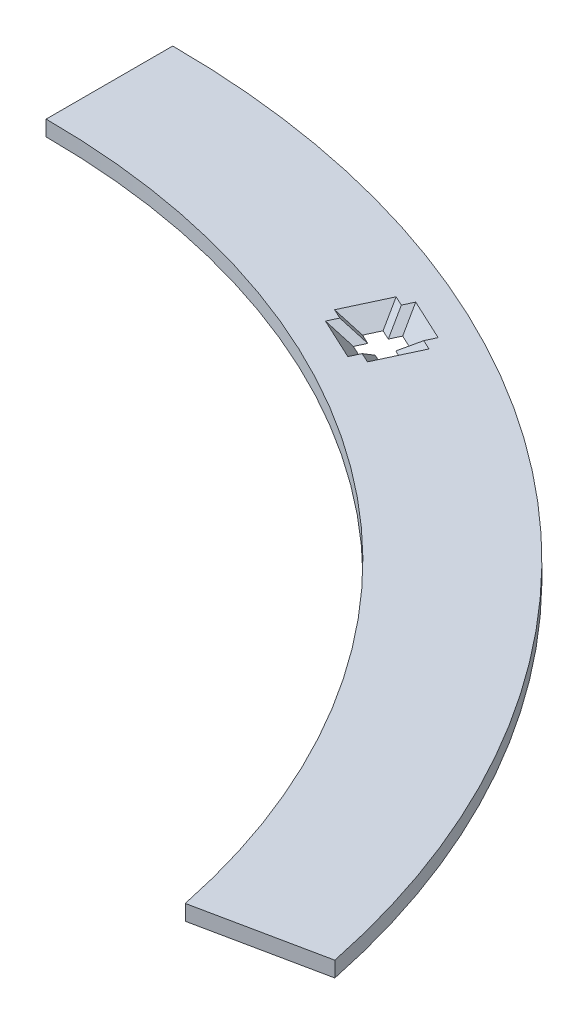
ISO-10303-21;
HEADER;
FILE_DESCRIPTION(('STEP AP214'),'2;1');
FILE_NAME('part.step','',(''),(''),'','','');
FILE_SCHEMA(('AUTOMOTIVE_DESIGN { 1 0 10303 214 1 1 1 1 }'));
ENDSEC;
DATA;
#1=APPLICATION_CONTEXT('core data for automotive mechanical design processes');
#2=APPLICATION_PROTOCOL_DEFINITION('international standard','automotive_design',2000,#1);
#3=PRODUCT_CONTEXT('',#1,'mechanical');
#4=PRODUCT('Part','Part','',(#3));
#5=PRODUCT_RELATED_PRODUCT_CATEGORY('part','',(#4));
#6=PRODUCT_DEFINITION_FORMATION('','',#4);
#7=PRODUCT_DEFINITION_CONTEXT('part definition',#1,'design');
#8=PRODUCT_DEFINITION('design','',#6,#7);
#9=PRODUCT_DEFINITION_SHAPE('','',#8);
#10=(LENGTH_UNIT() NAMED_UNIT(*) SI_UNIT(.MILLI.,.METRE.));
#11=(NAMED_UNIT(*) PLANE_ANGLE_UNIT() SI_UNIT($,.RADIAN.));
#12=(NAMED_UNIT(*) SI_UNIT($,.STERADIAN.) SOLID_ANGLE_UNIT());
#13=UNCERTAINTY_MEASURE_WITH_UNIT(LENGTH_MEASURE(1.E-05),#10,'distance_accuracy_value','');
#14=(GEOMETRIC_REPRESENTATION_CONTEXT(3) GLOBAL_UNCERTAINTY_ASSIGNED_CONTEXT((#13)) GLOBAL_UNIT_ASSIGNED_CONTEXT((#10,
#11,#12)) REPRESENTATION_CONTEXT('',''));
#15=CARTESIAN_POINT('',(0.,0.,0.));
#16=DIRECTION('',(0.,0.,1.));
#17=DIRECTION('',(1.,0.,0.));
#18=AXIS2_PLACEMENT_3D('',#15,#16,#17);
#19=CARTESIAN_POINT('',(0.,1.,0.));
#20=DIRECTION('',(0.,-1.,0.));
#21=DIRECTION('',(0.,0.,-1.));
#22=AXIS2_PLACEMENT_3D('',#19,#20,#21);
#23=PLANE('',#22);
#24=DIRECTION('',(-0.906307787036654,0.,-0.422618261740692));
#25=VECTOR('',#24,1.);
#26=CARTESIAN_POINT('',(21.276677548664,1.,-46.8110830401374));
#27=LINE('',#26,#25);
#28=CARTESIAN_POINT('',(23.0892931227373,1.,-45.965846516656));
#29=VERTEX_POINT('',#28);
#30=CARTESIAN_POINT('',(20.3703697616273,1.,-47.2337013018781));
#31=VERTEX_POINT('',#30);
#32=EDGE_CURVE('E49',#29,#31,#27,.T.);
#33=ORIENTED_EDGE('',*,*,#32,.T.);
#34=DIRECTION('',(0.422618261740694,0.,-0.906307787036652));
#35=VECTOR('',#34,1.);
#36=CARTESIAN_POINT('',(-1.35946168055505,1.,-0.633927392611075));
#37=LINE('',#36,#35);
#38=CARTESIAN_POINT('',(20.6662025448458,1.,-47.8681167528037));
#39=VERTEX_POINT('',#38);
#40=EDGE_CURVE('E11',#31,#39,#37,.T.);
#41=ORIENTED_EDGE('',*,*,#40,.T.);
#42=DIRECTION('',(-0.906307787036655,0.,-0.422618261740689));
#43=VECTOR('',#42,1.);
#44=CARTESIAN_POINT('',(20.9380948809568,1.,-47.7413312742815));
#45=LINE('',#44,#43);
#46=CARTESIAN_POINT('',(20.0317870939201,1.,-48.1639495360222));
#47=VERTEX_POINT('',#46);
#48=EDGE_CURVE('E167',#39,#47,#45,.T.);
#49=ORIENTED_EDGE('',*,*,#48,.T.);
#50=DIRECTION('',(0.422618261740692,0.,-0.906307787036654));
#51=VECTOR('',#50,1.);
#52=CARTESIAN_POINT('',(-1.99387713148058,1.,-0.929760175829492));
#53=LINE('',#52,#51);
#54=CARTESIAN_POINT('',(21.2996418791422,1.,-50.8828728971322));
#55=VERTEX_POINT('',#54);
#56=EDGE_CURVE('E233',#47,#55,#53,.T.);
#57=ORIENTED_EDGE('',*,*,#56,.T.);
#58=DIRECTION('',(0.906307787036655,0.,0.422618261740689));
#59=VECTOR('',#58,1.);
#60=CARTESIAN_POINT('',(22.8403651171046,1.,-50.164421852173));
#61=LINE('',#60,#59);
#62=CARTESIAN_POINT('',(21.9340573300679,1.,-50.5870401139137));
#63=VERTEX_POINT('',#62);
#64=EDGE_CURVE('E235',#55,#63,#61,.T.);
#65=ORIENTED_EDGE('',*,*,#64,.T.);
#66=DIRECTION('',(0.422618261740694,0.,-0.906307787036652));
#67=VECTOR('',#66,1.);
#68=CARTESIAN_POINT('',(-1.35946168055506,1.,-0.633927392611077));
#69=LINE('',#68,#67);
#70=CARTESIAN_POINT('',(22.2298901132864,1.,-51.2214555648394));
#71=VERTEX_POINT('',#70);
#72=EDGE_CURVE('E237',#63,#71,#69,.T.);
#73=ORIENTED_EDGE('',*,*,#72,.T.);
#74=DIRECTION('',(0.906307787036654,0.,0.422618261740692));
#75=VECTOR('',#74,1.);
#76=CARTESIAN_POINT('',(23.5893517938413,1.,-50.5875281722284));
#77=LINE('',#76,#75);
#78=CARTESIAN_POINT('',(24.9488134743964,1.,-49.9536007796173));
#79=VERTEX_POINT('',#78);
#80=EDGE_CURVE('E239',#71,#79,#77,.T.);
#81=ORIENTED_EDGE('',*,*,#80,.T.);
#82=DIRECTION('',(-0.422618261740694,0.,0.906307787036652));
#83=VECTOR('',#82,1.);
#84=CARTESIAN_POINT('',(1.35946168055494,1.,0.633927392611024));
#85=LINE('',#84,#83);
#86=CARTESIAN_POINT('',(24.6529806911779,1.,-49.3191853286916));
#87=VERTEX_POINT('',#86);
#88=EDGE_CURVE('E241',#79,#87,#85,.T.);
#89=ORIENTED_EDGE('',*,*,#88,.T.);
#90=DIRECTION('',(0.906307787036655,0.,0.422618261740689));
#91=VECTOR('',#90,1.);
#92=CARTESIAN_POINT('',(24.3810883550669,1.,-49.4459708072138));
#93=LINE('',#92,#91);
#94=CARTESIAN_POINT('',(25.2873961421035,1.,-49.0233525454731));
#95=VERTEX_POINT('',#94);
#96=EDGE_CURVE('E243',#87,#95,#93,.T.);
#97=ORIENTED_EDGE('',*,*,#96,.T.);
#98=DIRECTION('',(-0.422618261740692,0.,0.906307787036654));
#99=VECTOR('',#98,1.);
#100=CARTESIAN_POINT('',(24.4421596186221,1.,-47.2107369713998));
#101=LINE('',#100,#99);
#102=CARTESIAN_POINT('',(24.0195413568815,1.,-46.3044291843632));
#103=VERTEX_POINT('',#102);
#104=EDGE_CURVE('E245',#95,#103,#101,.T.);
#105=ORIENTED_EDGE('',*,*,#104,.T.);
#106=DIRECTION('',(-0.906307787036655,0.,-0.422618261740689));
#107=VECTOR('',#106,1.);
#108=CARTESIAN_POINT('',(22.4788181189191,1.,-47.0228802293223));
#109=LINE('',#108,#107);
#110=CARTESIAN_POINT('',(23.3851259059558,1.,-46.6002619675816));
#111=VERTEX_POINT('',#110);
#112=EDGE_CURVE('E247',#103,#111,#109,.T.);
#113=ORIENTED_EDGE('',*,*,#112,.T.);
#114=DIRECTION('',(-0.422618261740694,0.,0.906307787036652));
#115=VECTOR('',#114,1.);
#116=CARTESIAN_POINT('',(1.35946168055495,1.,0.633927392611025));
#117=LINE('',#116,#115);
#118=EDGE_CURVE('E60',#111,#29,#117,.T.);
#119=ORIENTED_EDGE('',*,*,#118,.T.);
#120=EDGE_LOOP('',(#33,#41,#49,#57,#65,#73,#81,#89,#97,#105,#113,#119));
#121=FACE_BOUND('',#120,.T.);
#122=CARTESIAN_POINT('',(0.,1.,0.));
#123=DIRECTION('',(0.,1.,0.));
#124=DIRECTION('',(0.,0.,1.));
#125=AXIS2_PLACEMENT_3D('',#122,#123,#124);
#126=CIRCLE('',#125,57.7152885589123);
#127=CARTESIAN_POINT('',(56.5176688859594,1.,-11.6964796898713));
#128=VERTEX_POINT('',#127);
#129=CARTESIAN_POINT('',(0.,1.,-57.7152885589123));
#130=VERTEX_POINT('',#129);
#131=EDGE_CURVE('E200',#128,#130,#126,.T.);
#132=ORIENTED_EDGE('',*,*,#131,.T.);
#133=DIRECTION('',(0.,0.,1.));
#134=VECTOR('',#133,1.);
#135=CARTESIAN_POINT('',(0.,1.,-49.5190345613467));
#136=LINE('',#135,#134);
#137=CARTESIAN_POINT('',(0.,1.,-49.5190345613467));
#138=VERTEX_POINT('',#137);
#139=EDGE_CURVE('E218',#130,#138,#136,.T.);
#140=ORIENTED_EDGE('',*,*,#139,.T.);
#141=CARTESIAN_POINT('',(0.,1.,0.));
#142=DIRECTION('',(0.,-1.,0.));
#143=DIRECTION('',(0.,0.,-1.));
#144=AXIS2_PLACEMENT_3D('',#141,#142,#143);
#145=CIRCLE('',#144,49.5190345613467);
#146=CARTESIAN_POINT('',(48.4914910537678,1.,-10.03544115972));
#147=VERTEX_POINT('',#146);
#148=EDGE_CURVE('E211',#138,#147,#145,.T.);
#149=ORIENTED_EDGE('',*,*,#148,.T.);
#150=DIRECTION('',(0.97924952479211,0.,-0.20265825469106));
#151=VECTOR('',#150,1.);
#152=CARTESIAN_POINT('',(48.4914910537678,1.,-10.03544115972));
#153=LINE('',#152,#151);
#154=EDGE_CURVE('E214',#147,#128,#153,.T.);
#155=ORIENTED_EDGE('',*,*,#154,.T.);
#156=EDGE_LOOP('',(#132,#140,#149,#155));
#157=FACE_BOUND('',#156,.T.);
#158=ADVANCED_FACE('F39',(#121,#157),#23,.F.);
#159=CARTESIAN_POINT('',(0.,0.,0.));
#160=DIRECTION('',(0.,-1.,0.));
#161=DIRECTION('',(0.,0.,-1.));
#162=AXIS2_PLACEMENT_3D('',#159,#160,#161);
#163=PLANE('',#162);
#164=DIRECTION('',(0.,0.,1.));
#165=VECTOR('',#164,1.);
#166=CARTESIAN_POINT('',(0.,0.,-49.5190345613467));
#167=LINE('',#166,#165);
#168=CARTESIAN_POINT('',(0.,0.,-57.7152885589123));
#169=VERTEX_POINT('',#168);
#170=CARTESIAN_POINT('',(0.,0.,-49.5190345613467));
#171=VERTEX_POINT('',#170);
#172=EDGE_CURVE('E215',#169,#171,#167,.T.);
#173=ORIENTED_EDGE('',*,*,#172,.F.);
#174=CARTESIAN_POINT('',(0.,0.,0.));
#175=DIRECTION('',(0.,1.,0.));
#176=DIRECTION('',(0.,0.,1.));
#177=AXIS2_PLACEMENT_3D('',#174,#175,#176);
#178=CIRCLE('',#177,57.7152885589123);
#179=CARTESIAN_POINT('',(56.5176688859594,0.,-11.6964796898713));
#180=VERTEX_POINT('',#179);
#181=EDGE_CURVE('E201',#180,#169,#178,.T.);
#182=ORIENTED_EDGE('',*,*,#181,.F.);
#183=DIRECTION('',(0.97924952479211,0.,-0.20265825469106));
#184=VECTOR('',#183,1.);
#185=CARTESIAN_POINT('',(48.4914910537678,0.,-10.03544115972));
#186=LINE('',#185,#184);
#187=CARTESIAN_POINT('',(48.4914910537678,0.,-10.03544115972));
#188=VERTEX_POINT('',#187);
#189=EDGE_CURVE('E223',#188,#180,#186,.T.);
#190=ORIENTED_EDGE('',*,*,#189,.F.);
#191=CARTESIAN_POINT('',(0.,0.,0.));
#192=DIRECTION('',(0.,-1.,0.));
#193=DIRECTION('',(0.,0.,-1.));
#194=AXIS2_PLACEMENT_3D('',#191,#192,#193);
#195=CIRCLE('',#194,49.5190345613467);
#196=EDGE_CURVE('E208',#171,#188,#195,.T.);
#197=ORIENTED_EDGE('',*,*,#196,.F.);
#198=EDGE_LOOP('',(#173,#182,#190,#197));
#199=FACE_BOUND('',#198,.T.);
#200=DIRECTION('',(-0.422618261740692,0.,0.906307787036654));
#201=VECTOR('',#200,1.);
#202=CARTESIAN_POINT('',(-1.0875693444439,0.,-0.50714191408879));
#203=LINE('',#202,#201);
#204=CARTESIAN_POINT('',(21.7833314044382,0.,-49.5539468483548));
#205=VERTEX_POINT('',#204);
#206=CARTESIAN_POINT('',(21.3607131426975,0.,-48.6476390613182));
#207=VERTEX_POINT('',#206);
#208=EDGE_CURVE('E159',#205,#207,#203,.T.);
#209=ORIENTED_EDGE('',*,*,#208,.T.);
#210=DIRECTION('',(-0.906307787036655,0.,-0.422618261740689));
#211=VECTOR('',#210,1.);
#212=CARTESIAN_POINT('',(22.4482824871413,0.,-48.1404971472295));
#213=LINE('',#212,#211);
#214=CARTESIAN_POINT('',(21.9951285936232,0.,-48.3518062780997));
#215=VERTEX_POINT('',#214);
#216=EDGE_CURVE('E153',#215,#207,#213,.T.);
#217=ORIENTED_EDGE('',*,*,#216,.F.);
#218=DIRECTION('',(-0.422618261740694,0.,0.906307787036652));
#219=VECTOR('',#218,1.);
#220=CARTESIAN_POINT('',(-0.45315389351838,0.,-0.211309130870372));
#221=LINE('',#220,#219);
#222=CARTESIAN_POINT('',(21.6992958104047,0.,-47.7173908271741));
#223=VERTEX_POINT('',#222);
#224=EDGE_CURVE('E157',#215,#223,#221,.T.);
#225=ORIENTED_EDGE('',*,*,#224,.T.);
#226=DIRECTION('',(-0.906307787036654,0.,-0.422618261740692));
#227=VECTOR('',#226,1.);
#228=CARTESIAN_POINT('',(22.1524497039229,0.,-47.5060816963037));
#229=LINE('',#228,#227);
#230=CARTESIAN_POINT('',(22.6056035974413,0.,-47.2947725654334));
#231=VERTEX_POINT('',#230);
#232=EDGE_CURVE('E175',#231,#223,#229,.T.);
#233=ORIENTED_EDGE('',*,*,#232,.F.);
#234=DIRECTION('',(0.422618261740694,0.,-0.906307787036652));
#235=VECTOR('',#234,1.);
#236=CARTESIAN_POINT('',(0.453153893518273,0.,0.211309130870322));
#237=LINE('',#236,#235);
#238=CARTESIAN_POINT('',(22.9014363806598,0.,-47.929188016359));
#239=VERTEX_POINT('',#238);
#240=EDGE_CURVE('E177',#231,#239,#237,.T.);
#241=ORIENTED_EDGE('',*,*,#240,.T.);
#242=DIRECTION('',(-0.906307787036655,0.,-0.422618261740689));
#243=VECTOR('',#242,1.);
#244=CARTESIAN_POINT('',(22.4482824871413,0.,-48.1404971472295));
#245=LINE('',#244,#243);
#246=CARTESIAN_POINT('',(23.5358518315855,0.,-47.6333552331405));
#247=VERTEX_POINT('',#246);
#248=EDGE_CURVE('E181',#247,#239,#245,.T.);
#249=ORIENTED_EDGE('',*,*,#248,.F.);
#250=DIRECTION('',(-0.422618261740692,0.,0.906307787036654));
#251=VECTOR('',#250,1.);
#252=CARTESIAN_POINT('',(1.08756934444406,0.,0.507141914088866));
#253=LINE('',#252,#251);
#254=CARTESIAN_POINT('',(23.9584700933262,0.,-48.5396630201772));
#255=VERTEX_POINT('',#254);
#256=EDGE_CURVE('E184',#255,#247,#253,.T.);
#257=ORIENTED_EDGE('',*,*,#256,.F.);
#258=DIRECTION('',(0.906307787036655,0.,0.422618261740689));
#259=VECTOR('',#258,1.);
#260=CARTESIAN_POINT('',(22.870900748882,0.,-49.0468049342661));
#261=LINE('',#260,#259);
#262=CARTESIAN_POINT('',(23.3240546424005,0.,-48.8354958033956));
#263=VERTEX_POINT('',#262);
#264=EDGE_CURVE('E187',#263,#255,#261,.T.);
#265=ORIENTED_EDGE('',*,*,#264,.F.);
#266=DIRECTION('',(0.422618261740694,0.,-0.906307787036652));
#267=VECTOR('',#266,1.);
#268=CARTESIAN_POINT('',(0.453153893518273,0.,0.211309130870322));
#269=LINE('',#268,#267);
#270=CARTESIAN_POINT('',(23.619887425619,0.,-49.4699112543213));
#271=VERTEX_POINT('',#270);
#272=EDGE_CURVE('E190',#263,#271,#269,.T.);
#273=ORIENTED_EDGE('',*,*,#272,.T.);
#274=DIRECTION('',(-0.906307787036654,0.,-0.422618261740692));
#275=VECTOR('',#274,1.);
#276=CARTESIAN_POINT('',(23.1667335321006,0.,-49.6812203851917));
#277=LINE('',#276,#275);
#278=CARTESIAN_POINT('',(22.7135796385823,0.,-49.892529516062));
#279=VERTEX_POINT('',#278);
#280=EDGE_CURVE('E192',#271,#279,#277,.T.);
#281=ORIENTED_EDGE('',*,*,#280,.T.);
#282=DIRECTION('',(-0.422618261740694,0.,0.906307787036652));
#283=VECTOR('',#282,1.);
#284=CARTESIAN_POINT('',(-0.45315389351838,0.,-0.211309130870372));
#285=LINE('',#284,#283);
#286=CARTESIAN_POINT('',(22.4177468553639,0.,-49.2581140651363));
#287=VERTEX_POINT('',#286);
#288=EDGE_CURVE('E194',#279,#287,#285,.T.);
#289=ORIENTED_EDGE('',*,*,#288,.T.);
#290=DIRECTION('',(0.906307787036655,0.,0.422618261740689));
#291=VECTOR('',#290,1.);
#292=CARTESIAN_POINT('',(22.870900748882,0.,-49.0468049342661));
#293=LINE('',#292,#291);
#294=EDGE_CURVE('E196',#205,#287,#293,.T.);
#295=ORIENTED_EDGE('',*,*,#294,.F.);
#296=EDGE_LOOP('',(#209,#217,#225,#233,#241,#249,#257,#265,#273,#281,#289,#295));
#297=FACE_BOUND('',#296,.T.);
#298=ADVANCED_FACE('F155',(#199,#297),#163,.T.);
#299=CARTESIAN_POINT('',(48.4914910537678,1.,-10.03544115972));
#300=DIRECTION('',(-0.20265825469106,0.,-0.97924952479211));
#301=DIRECTION('',(-0.97924952479211,0.,0.20265825469106));
#302=AXIS2_PLACEMENT_3D('',#299,#300,#301);
#303=PLANE('',#302);
#304=DIRECTION('',(0.,1.,0.));
#305=VECTOR('',#304,1.);
#306=CARTESIAN_POINT('',(56.5176688859594,0.,-11.6964796898713));
#307=LINE('',#306,#305);
#308=EDGE_CURVE('E203',#180,#128,#307,.T.);
#309=ORIENTED_EDGE('',*,*,#308,.T.);
#310=ORIENTED_EDGE('',*,*,#154,.F.);
#311=DIRECTION('',(0.,-1.,0.));
#312=VECTOR('',#311,1.);
#313=CARTESIAN_POINT('',(48.4914910537678,1.,-10.03544115972));
#314=LINE('',#313,#312);
#315=EDGE_CURVE('E229',#147,#188,#314,.T.);
#316=ORIENTED_EDGE('',*,*,#315,.T.);
#317=ORIENTED_EDGE('',*,*,#189,.T.);
#318=EDGE_LOOP('',(#309,#310,#316,#317));
#319=FACE_BOUND('',#318,.T.);
#320=ADVANCED_FACE('F327',(#319),#303,.F.);
#321=CARTESIAN_POINT('',(0.,1.,-49.5190345613467));
#322=DIRECTION('',(1.,0.,0.));
#323=DIRECTION('',(0.,0.,-1.));
#324=AXIS2_PLACEMENT_3D('',#321,#322,#323);
#325=PLANE('',#324);
#326=DIRECTION('',(0.,1.,0.));
#327=VECTOR('',#326,1.);
#328=CARTESIAN_POINT('',(0.,0.,-57.7152885589123));
#329=LINE('',#328,#327);
#330=EDGE_CURVE('E206',#169,#130,#329,.T.);
#331=ORIENTED_EDGE('',*,*,#330,.F.);
#332=ORIENTED_EDGE('',*,*,#172,.T.);
#333=DIRECTION('',(0.,-1.,0.));
#334=VECTOR('',#333,1.);
#335=CARTESIAN_POINT('',(0.,1.,-49.5190345613467));
#336=LINE('',#335,#334);
#337=EDGE_CURVE('E220',#138,#171,#336,.T.);
#338=ORIENTED_EDGE('',*,*,#337,.F.);
#339=ORIENTED_EDGE('',*,*,#139,.F.);
#340=EDGE_LOOP('',(#331,#332,#338,#339));
#341=FACE_BOUND('',#340,.T.);
#342=ADVANCED_FACE('F333',(#341),#325,.F.);
#343=CARTESIAN_POINT('',(0.,1.,0.));
#344=DIRECTION('',(0.,-1.,0.));
#345=DIRECTION('',(0.,0.,-1.));
#346=AXIS2_PLACEMENT_3D('',#343,#344,#345);
#347=CYLINDRICAL_SURFACE('',#346,49.5190345613467);
#348=ORIENTED_EDGE('',*,*,#196,.T.);
#349=ORIENTED_EDGE('',*,*,#315,.F.);
#350=ORIENTED_EDGE('',*,*,#148,.F.);
#351=ORIENTED_EDGE('',*,*,#337,.T.);
#352=EDGE_LOOP('',(#348,#349,#350,#351));
#353=FACE_BOUND('',#352,.T.);
#354=ADVANCED_FACE('F336',(#353),#347,.F.);
#355=CARTESIAN_POINT('',(0.,0.,0.));
#356=DIRECTION('',(0.,1.,0.));
#357=DIRECTION('',(0.,0.,1.));
#358=AXIS2_PLACEMENT_3D('',#355,#356,#357);
#359=CYLINDRICAL_SURFACE('',#358,57.7152885589123);
#360=ORIENTED_EDGE('',*,*,#131,.F.);
#361=ORIENTED_EDGE('',*,*,#308,.F.);
#362=ORIENTED_EDGE('',*,*,#181,.T.);
#363=ORIENTED_EDGE('',*,*,#330,.T.);
#364=EDGE_LOOP('',(#360,#361,#362,#363));
#365=FACE_BOUND('',#364,.T.);
#366=ADVANCED_FACE('F331',(#365),#359,.T.);
#367=CARTESIAN_POINT('',(0.453153893518273,0.,0.211309130870322));
#368=DIRECTION('',(0.640856382055789,-0.707106781186549,0.298836238730115));
#369=DIRECTION('',(0.422618261740694,0.,-0.906307787036652));
#370=AXIS2_PLACEMENT_3D('',#367,#368,#369);
#371=PLANE('',#370);
#372=DIRECTION('',(-0.767255811994708,-0.577350269189625,0.279258277633824));
#373=VECTOR('',#372,1.);
#374=CARTESIAN_POINT('',(-0.648513918648944,-18.0390538533765,-40.1101944082677));
#375=LINE('',#374,#373);
#376=EDGE_CURVE('E273',#87,#263,#375,.T.);
#377=ORIENTED_EDGE('',*,*,#376,.F.);
#378=ORIENTED_EDGE('',*,*,#88,.F.);
#379=DIRECTION('',(0.767255811994708,0.577350269189625,-0.279258277633824));
#380=VECTOR('',#379,1.);
#381=CARTESIAN_POINT('',(-0.662763880145171,-18.2723871867098,-40.6317489699577));
#382=LINE('',#381,#380);
#383=EDGE_CURVE('E44',#271,#79,#382,.T.);
#384=ORIENTED_EDGE('',*,*,#383,.F.);
#385=ORIENTED_EDGE('',*,*,#272,.F.);
#386=EDGE_LOOP('',(#377,#378,#384,#385));
#387=FACE_BOUND('',#386,.T.);
#388=ADVANCED_FACE('F42',(#387),#371,.F.);
#389=CARTESIAN_POINT('',(23.1667335321006,0.,-49.6812203851917));
#390=DIRECTION('',(0.298836238730114,-0.707106781186548,-0.640856382055791));
#391=DIRECTION('',(-0.906307787036654,0.,-0.422618261740692));
#392=AXIS2_PLACEMENT_3D('',#389,#390,#391);
#393=PLANE('',#392);
#394=ORIENTED_EDGE('',*,*,#383,.T.);
#395=ORIENTED_EDGE('',*,*,#80,.F.);
#396=DIRECTION('',(-0.279258277633829,0.577350269189624,-0.767255811994706));
#397=VECTOR('',#396,1.);
#398=CARTESIAN_POINT('',(22.794194559465,-0.166666666666649,-49.6710418412658));
#399=LINE('',#398,#397);
#400=EDGE_CURVE('E271',#279,#71,#399,.T.);
#401=ORIENTED_EDGE('',*,*,#400,.F.);
#402=ORIENTED_EDGE('',*,*,#280,.F.);
#403=EDGE_LOOP('',(#394,#395,#401,#402));
#404=FACE_BOUND('',#403,.T.);
#405=ADVANCED_FACE('F283',(#404),#393,.F.);
#406=CARTESIAN_POINT('',(23.2935190106226,1.,-49.9531127213028));
#407=DIRECTION('',(-0.298836238730113,0.707106781186546,0.640856382055793));
#408=DIRECTION('',(-0.906307787036655,0.,-0.422618261740689));
#409=AXIS2_PLACEMENT_3D('',#406,#407,#408);
#410=PLANE('',#409);
#411=ORIENTED_EDGE('',*,*,#376,.T.);
#412=ORIENTED_EDGE('',*,*,#264,.T.);
#413=DIRECTION('',(0.767255811994707,0.577350269189625,-0.279258277633825));
#414=VECTOR('',#413,1.);
#415=CARTESIAN_POINT('',(0.871852231461691,-17.3723871867098,-40.1368213085799));
#416=LINE('',#415,#414);
#417=EDGE_CURVE('E268',#95,#255,#416,.F.);
#418=ORIENTED_EDGE('',*,*,#417,.F.);
#419=ORIENTED_EDGE('',*,*,#96,.F.);
#420=EDGE_LOOP('',(#411,#412,#418,#419));
#421=FACE_BOUND('',#420,.T.);
#422=ADVANCED_FACE('F299',(#421),#410,.T.);
#423=CARTESIAN_POINT('',(-0.45315389351838,0.,-0.211309130870372));
#424=DIRECTION('',(-0.640856382055787,-0.707106781186551,-0.298836238730114));
#425=DIRECTION('',(-0.422618261740694,0.,0.906307787036652));
#426=AXIS2_PLACEMENT_3D('',#423,#424,#425);
#427=PLANE('',#426);
#428=ORIENTED_EDGE('',*,*,#400,.T.);
#429=ORIENTED_EDGE('',*,*,#72,.F.);
#430=DIRECTION('',(0.279258277633831,-0.577350269189625,0.767255811994704));
#431=VECTOR('',#430,1.);
#432=CARTESIAN_POINT('',(22.1759020927158,0.500000000000077,-49.9225770895251));
#433=LINE('',#432,#431);
#434=EDGE_CURVE('E265',#287,#63,#433,.F.);
#435=ORIENTED_EDGE('',*,*,#434,.F.);
#436=ORIENTED_EDGE('',*,*,#288,.F.);
#437=EDGE_LOOP('',(#428,#429,#435,#436));
#438=FACE_BOUND('',#437,.T.);
#439=ADVANCED_FACE('F294',(#438),#427,.F.);
#440=CARTESIAN_POINT('',(1.99387713148073,1.,0.929760175829565));
#441=DIRECTION('',(-0.64085638205579,0.707106781186549,-0.298836238730114));
#442=DIRECTION('',(0.422618261740692,0.,-0.906307787036654));
#443=AXIS2_PLACEMENT_3D('',#440,#441,#442);
#444=PLANE('',#443);
#445=ORIENTED_EDGE('',*,*,#417,.T.);
#446=ORIENTED_EDGE('',*,*,#256,.T.);
#447=DIRECTION('',(0.279258277633826,0.577350269189624,0.767255811994707));
#448=VECTOR('',#447,1.);
#449=CARTESIAN_POINT('',(23.6648357049977,0.266666666666582,-47.2789749534667));
#450=LINE('',#449,#448);
#451=EDGE_CURVE('E262',#103,#247,#450,.F.);
#452=ORIENTED_EDGE('',*,*,#451,.F.);
#453=ORIENTED_EDGE('',*,*,#104,.F.);
#454=EDGE_LOOP('',(#445,#446,#452,#453));
#455=FACE_BOUND('',#454,.T.);
#456=ADVANCED_FACE('F302',(#455),#444,.T.);
#457=CARTESIAN_POINT('',(23.2935190106226,1.,-49.9531127213028));
#458=DIRECTION('',(-0.298836238730113,0.707106781186546,0.640856382055793));
#459=DIRECTION('',(-0.906307787036655,0.,-0.422618261740689));
#460=AXIS2_PLACEMENT_3D('',#457,#458,#459);
#461=PLANE('',#460);
#462=ORIENTED_EDGE('',*,*,#434,.T.);
#463=ORIENTED_EDGE('',*,*,#64,.F.);
#464=DIRECTION('',(0.27925827763383,-0.577350269189626,0.767255811994704));
#465=VECTOR('',#464,1.);
#466=CARTESIAN_POINT('',(21.6543475310259,0.266666666666745,-49.9083271280289));
#467=LINE('',#466,#465);
#468=EDGE_CURVE('E259',#205,#55,#467,.F.);
#469=ORIENTED_EDGE('',*,*,#468,.F.);
#470=ORIENTED_EDGE('',*,*,#294,.T.);
#471=EDGE_LOOP('',(#462,#463,#469,#470));
#472=FACE_BOUND('',#471,.T.);
#473=ADVANCED_FACE('F297',(#472),#461,.T.);
#474=CARTESIAN_POINT('',(22.0256642254006,1.,-47.2341893601928));
#475=DIRECTION('',(0.298836238730111,0.70710678118655,-0.64085638205579));
#476=DIRECTION('',(0.906307787036655,0.,0.422618261740689));
#477=AXIS2_PLACEMENT_3D('',#474,#475,#476);
#478=PLANE('',#477);
#479=ORIENTED_EDGE('',*,*,#451,.T.);
#480=ORIENTED_EDGE('',*,*,#248,.T.);
#481=DIRECTION('',(-0.279258277633826,-0.577350269189624,-0.767255811994707));
#482=VECTOR('',#481,1.);
#483=CARTESIAN_POINT('',(23.1432811433078,0.499999999999914,-47.2647249919704));
#484=LINE('',#483,#482);
#485=EDGE_CURVE('E256',#111,#239,#484,.T.);
#486=ORIENTED_EDGE('',*,*,#485,.F.);
#487=ORIENTED_EDGE('',*,*,#112,.F.);
#488=EDGE_LOOP('',(#479,#480,#486,#487));
#489=FACE_BOUND('',#488,.T.);
#490=ADVANCED_FACE('F307',(#489),#478,.T.);
#491=CARTESIAN_POINT('',(-1.0875693444439,0.,-0.50714191408879));
#492=DIRECTION('',(-0.64085638205579,-0.707106781186549,-0.298836238730114));
#493=DIRECTION('',(-0.422618261740692,0.,0.906307787036654));
#494=AXIS2_PLACEMENT_3D('',#491,#492,#493);
#495=PLANE('',#494);
#496=ORIENTED_EDGE('',*,*,#468,.T.);
#497=ORIENTED_EDGE('',*,*,#56,.F.);
#498=DIRECTION('',(0.767255811994707,-0.577350269189623,-0.27925827763383));
#499=VECTOR('',#498,1.);
#500=CARTESIAN_POINT('',(-2.16888006875959,17.7057205200432,-40.0835675079554));
#501=LINE('',#500,#499);
#502=EDGE_CURVE('E254',#207,#47,#501,.F.);
#503=ORIENTED_EDGE('',*,*,#502,.F.);
#504=ORIENTED_EDGE('',*,*,#208,.F.);
#505=EDGE_LOOP('',(#496,#497,#503,#504));
#506=FACE_BOUND('',#505,.T.);
#507=ADVANCED_FACE('F360',(#506),#495,.F.);
#508=CARTESIAN_POINT('',(0.453153893518273,0.,0.211309130870322));
#509=DIRECTION('',(0.640856382055788,-0.70710678118655,0.298836238730115));
#510=DIRECTION('',(0.422618261740694,0.,-0.906307787036652));
#511=AXIS2_PLACEMENT_3D('',#508,#509,#510);
#512=PLANE('',#511);
#513=ORIENTED_EDGE('',*,*,#485,.T.);
#514=ORIENTED_EDGE('',*,*,#240,.F.);
#515=DIRECTION('',(-0.279258277633823,-0.577350269189622,-0.76725581199471));
#516=VECTOR('',#515,1.);
#517=CARTESIAN_POINT('',(22.8474483600893,0.499999999999969,-46.6303095410447));
#518=LINE('',#517,#516);
#519=EDGE_CURVE('E169',#29,#231,#518,.T.);
#520=ORIENTED_EDGE('',*,*,#519,.F.);
#521=ORIENTED_EDGE('',*,*,#118,.F.);
#522=EDGE_LOOP('',(#513,#514,#520,#521));
#523=FACE_BOUND('',#522,.T.);
#524=ADVANCED_FACE('F310',(#523),#512,.F.);
#525=CARTESIAN_POINT('',(22.0256642254006,1.,-47.2341893601928));
#526=DIRECTION('',(0.298836238730111,0.70710678118655,-0.64085638205579));
#527=DIRECTION('',(0.906307787036655,0.,0.422618261740689));
#528=AXIS2_PLACEMENT_3D('',#525,#526,#527);
#529=PLANE('',#528);
#530=ORIENTED_EDGE('',*,*,#502,.T.);
#531=ORIENTED_EDGE('',*,*,#48,.F.);
#532=DIRECTION('',(-0.767255811994708,0.577350269189622,0.279258277633828));
#533=VECTOR('',#532,1.);
#534=CARTESIAN_POINT('',(21.3306655692344,0.500000000000076,-48.1099615154517));
#535=LINE('',#534,#533);
#536=EDGE_CURVE('E165',#215,#39,#535,.T.);
#537=ORIENTED_EDGE('',*,*,#536,.F.);
#538=ORIENTED_EDGE('',*,*,#216,.T.);
#539=EDGE_LOOP('',(#530,#531,#537,#538));
#540=FACE_BOUND('',#539,.T.);
#541=ADVANCED_FACE('F166',(#540),#529,.T.);
#542=CARTESIAN_POINT('',(21.7298314421822,1.,-46.5997739092671));
#543=DIRECTION('',(0.298836238730112,0.707106781186553,-0.640856382055787));
#544=DIRECTION('',(0.906307787036654,0.,0.422618261740692));
#545=AXIS2_PLACEMENT_3D('',#542,#543,#544);
#546=PLANE('',#545);
#547=ORIENTED_EDGE('',*,*,#519,.T.);
#548=ORIENTED_EDGE('',*,*,#232,.T.);
#549=DIRECTION('',(0.767255811994708,-0.577350269189621,-0.279258277633829));
#550=VECTOR('',#549,1.);
#551=CARTESIAN_POINT('',(-1.52021465633783,17.4723871867098,-39.2661801630469));
#552=LINE('',#551,#550);
#553=EDGE_CURVE('E170',#31,#223,#552,.T.);
#554=ORIENTED_EDGE('',*,*,#553,.F.);
#555=ORIENTED_EDGE('',*,*,#32,.F.);
#556=EDGE_LOOP('',(#547,#548,#554,#555));
#557=FACE_BOUND('',#556,.T.);
#558=ADVANCED_FACE('F312',(#557),#546,.T.);
#559=CARTESIAN_POINT('',(-0.45315389351838,0.,-0.211309130870372));
#560=DIRECTION('',(-0.640856382055788,-0.70710678118655,-0.298836238730115));
#561=DIRECTION('',(-0.422618261740694,0.,0.906307787036652));
#562=AXIS2_PLACEMENT_3D('',#559,#560,#561);
#563=PLANE('',#562);
#564=ORIENTED_EDGE('',*,*,#536,.T.);
#565=ORIENTED_EDGE('',*,*,#40,.F.);
#566=ORIENTED_EDGE('',*,*,#553,.T.);
#567=ORIENTED_EDGE('',*,*,#224,.F.);
#568=EDGE_LOOP('',(#564,#565,#566,#567));
#569=FACE_BOUND('',#568,.T.);
#570=ADVANCED_FACE('F172',(#569),#563,.F.);
#571=CLOSED_SHELL('',(#158,#298,#320,#342,#354,#366,#388,#405,#422,#439,#456,#473,#490,#507,
#524,#541,#558,#570));
#572=MANIFOLD_SOLID_BREP('B2',#571);
#573=ADVANCED_BREP_SHAPE_REPRESENTATION('',(#18,#572),#14);
#574=SHAPE_DEFINITION_REPRESENTATION(#9,#573);
ENDSEC;
END-ISO-10303-21;
